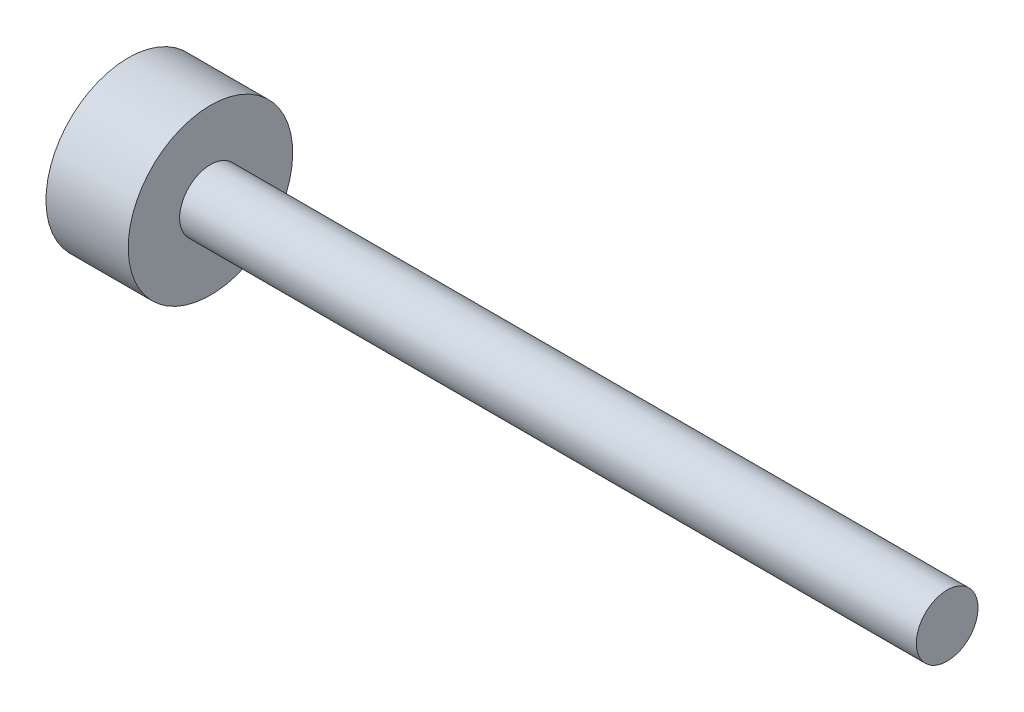
ISO-10303-21;
HEADER;
FILE_DESCRIPTION(('STEP AP214'),'2;1');
FILE_NAME('part.step','',(''),(''),'','','');
FILE_SCHEMA(('AUTOMOTIVE_DESIGN { 1 0 10303 214 1 1 1 1 }'));
ENDSEC;
DATA;
#1=APPLICATION_CONTEXT('core data for automotive mechanical design processes');
#2=APPLICATION_PROTOCOL_DEFINITION('international standard','automotive_design',2000,#1);
#3=PRODUCT_CONTEXT('',#1,'mechanical');
#4=PRODUCT('Part','Part','',(#3));
#5=PRODUCT_RELATED_PRODUCT_CATEGORY('part','',(#4));
#6=PRODUCT_DEFINITION_FORMATION('','',#4);
#7=PRODUCT_DEFINITION_CONTEXT('part definition',#1,'design');
#8=PRODUCT_DEFINITION('design','',#6,#7);
#9=PRODUCT_DEFINITION_SHAPE('','',#8);
#10=(LENGTH_UNIT() NAMED_UNIT(*) SI_UNIT(.MILLI.,.METRE.));
#11=(NAMED_UNIT(*) PLANE_ANGLE_UNIT() SI_UNIT($,.RADIAN.));
#12=(NAMED_UNIT(*) SI_UNIT($,.STERADIAN.) SOLID_ANGLE_UNIT());
#13=UNCERTAINTY_MEASURE_WITH_UNIT(LENGTH_MEASURE(1.E-05),#10,'distance_accuracy_value','');
#14=(GEOMETRIC_REPRESENTATION_CONTEXT(3) GLOBAL_UNCERTAINTY_ASSIGNED_CONTEXT((#13)) GLOBAL_UNIT_ASSIGNED_CONTEXT((#10,
#11,#12)) REPRESENTATION_CONTEXT('',''));
#15=CARTESIAN_POINT('',(0.,0.,0.));
#16=DIRECTION('',(0.,0.,1.));
#17=DIRECTION('',(1.,0.,0.));
#18=AXIS2_PLACEMENT_3D('',#15,#16,#17);
#19=CARTESIAN_POINT('',(0.,0.,0.));
#20=DIRECTION('',(1.,0.,0.));
#21=DIRECTION('',(0.,1.,0.));
#22=AXIS2_PLACEMENT_3D('',#19,#20,#21);
#23=CYLINDRICAL_SURFACE('',#22,0.75);
#24=CARTESIAN_POINT('',(-17.914000002,0.,0.));
#25=DIRECTION('',(1.,0.,0.));
#26=DIRECTION('',(0.,1.,0.));
#27=AXIS2_PLACEMENT_3D('',#24,#25,#26);
#28=CIRCLE('',#27,0.75);
#29=CARTESIAN_POINT('',(-17.914000002,0.749999999999998,0.));
#30=VERTEX_POINT('',#29);
#31=EDGE_CURVE('E10',#30,#30,#28,.T.);
#32=ORIENTED_EDGE('',*,*,#31,.T.);
#33=EDGE_LOOP('',(#32));
#34=FACE_BOUND('',#33,.T.);
#35=CARTESIAN_POINT('',(0.,0.,0.));
#36=DIRECTION('',(1.,0.,0.));
#37=DIRECTION('',(0.,1.,0.));
#38=AXIS2_PLACEMENT_3D('',#35,#36,#37);
#39=CIRCLE('',#38,0.75);
#40=CARTESIAN_POINT('',(0.,0.75,0.));
#41=VERTEX_POINT('',#40);
#42=EDGE_CURVE('E56',#41,#41,#39,.T.);
#43=ORIENTED_EDGE('',*,*,#42,.F.);
#44=EDGE_LOOP('',(#43));
#45=FACE_BOUND('',#44,.T.);
#46=ADVANCED_FACE('F38',(#34,#45),#23,.T.);
#47=CARTESIAN_POINT('',(-17.914000002,0.,0.));
#48=DIRECTION('',(1.,0.,0.));
#49=DIRECTION('',(0.,1.,0.));
#50=AXIS2_PLACEMENT_3D('',#47,#48,#49);
#51=PLANE('',#50);
#52=CARTESIAN_POINT('',(-17.914000002,0.,0.));
#53=DIRECTION('',(1.,0.,0.));
#54=DIRECTION('',(0.,1.,0.));
#55=AXIS2_PLACEMENT_3D('',#52,#53,#54);
#56=CIRCLE('',#55,2.);
#57=CARTESIAN_POINT('',(-17.914000002,2.,0.));
#58=VERTEX_POINT('',#57);
#59=EDGE_CURVE('E45',#58,#58,#56,.T.);
#60=ORIENTED_EDGE('',*,*,#59,.T.);
#61=EDGE_LOOP('',(#60));
#62=FACE_BOUND('',#61,.T.);
#63=ORIENTED_EDGE('',*,*,#31,.F.);
#64=EDGE_LOOP('',(#63));
#65=FACE_BOUND('',#64,.T.);
#66=ADVANCED_FACE('F65',(#62,#65),#51,.T.);
#67=CARTESIAN_POINT('',(0.,0.,0.));
#68=DIRECTION('',(1.,0.,0.));
#69=DIRECTION('',(0.,1.,0.));
#70=AXIS2_PLACEMENT_3D('',#67,#68,#69);
#71=CYLINDRICAL_SURFACE('',#70,2.);
#72=CARTESIAN_POINT('',(-19.914000002,0.,0.));
#73=DIRECTION('',(1.,0.,0.));
#74=DIRECTION('',(0.,1.,0.));
#75=AXIS2_PLACEMENT_3D('',#72,#73,#74);
#76=CIRCLE('',#75,2.);
#77=CARTESIAN_POINT('',(-19.914000002,2.,0.));
#78=VERTEX_POINT('',#77);
#79=EDGE_CURVE('E51',#78,#78,#76,.T.);
#80=ORIENTED_EDGE('',*,*,#79,.T.);
#81=EDGE_LOOP('',(#80));
#82=FACE_BOUND('',#81,.T.);
#83=ORIENTED_EDGE('',*,*,#59,.F.);
#84=EDGE_LOOP('',(#83));
#85=FACE_BOUND('',#84,.T.);
#86=ADVANCED_FACE('F69',(#82,#85),#71,.T.);
#87=CARTESIAN_POINT('',(-19.914000002,0.,0.));
#88=DIRECTION('',(1.,0.,0.));
#89=DIRECTION('',(0.,1.,0.));
#90=AXIS2_PLACEMENT_3D('',#87,#88,#89);
#91=PLANE('',#90);
#92=ORIENTED_EDGE('',*,*,#79,.F.);
#93=EDGE_LOOP('',(#92));
#94=FACE_BOUND('',#93,.T.);
#95=ADVANCED_FACE('F73',(#94),#91,.F.);
#96=CARTESIAN_POINT('',(0.,0.,0.));
#97=DIRECTION('',(1.,0.,0.));
#98=DIRECTION('',(0.,1.,0.));
#99=AXIS2_PLACEMENT_3D('',#96,#97,#98);
#100=PLANE('',#99);
#101=ORIENTED_EDGE('',*,*,#42,.T.);
#102=EDGE_LOOP('',(#101));
#103=FACE_BOUND('',#102,.T.);
#104=ADVANCED_FACE('F62',(#103),#100,.T.);
#105=CLOSED_SHELL('',(#46,#66,#86,#95,#104));
#106=MANIFOLD_SOLID_BREP('B2',#105);
#107=ADVANCED_BREP_SHAPE_REPRESENTATION('',(#18,#106),#14);
#108=SHAPE_DEFINITION_REPRESENTATION(#9,#107);
ENDSEC;
END-ISO-10303-21;
